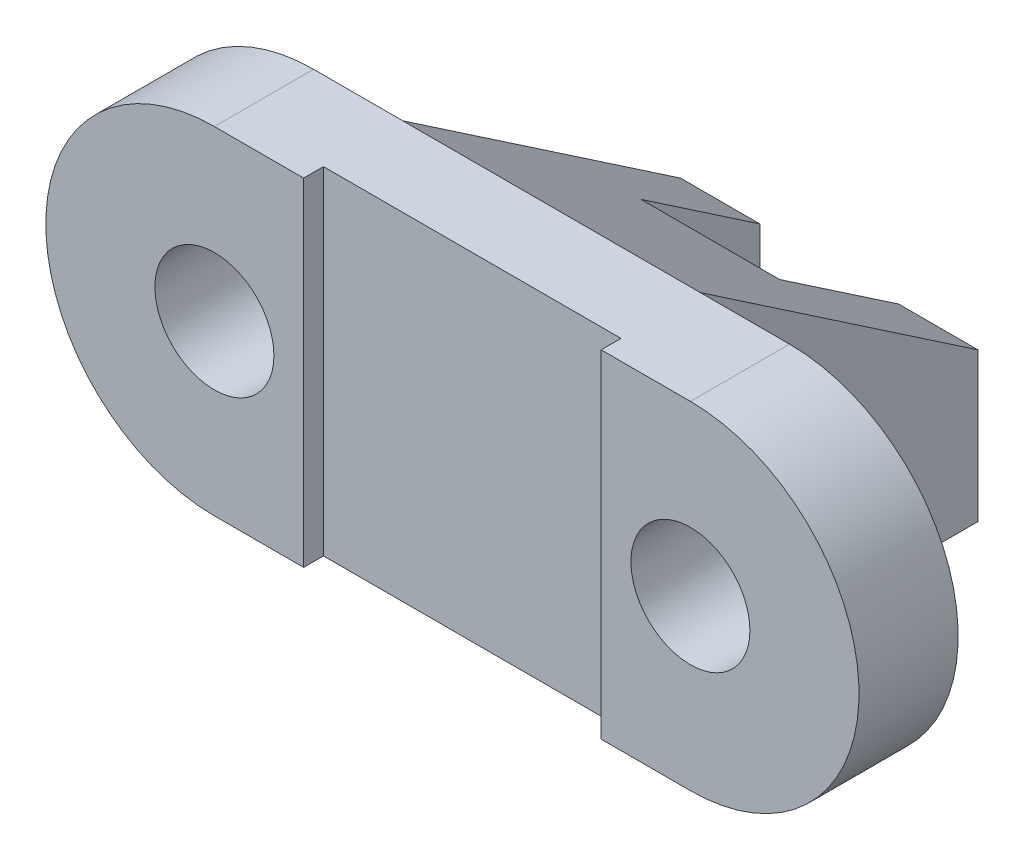
ISO-10303-21;
HEADER;
FILE_DESCRIPTION(('STEP AP214'),'2;1');
FILE_NAME('part.step','',(''),(''),'','','');
FILE_SCHEMA(('AUTOMOTIVE_DESIGN { 1 0 10303 214 1 1 1 1 }'));
ENDSEC;
DATA;
#1=APPLICATION_CONTEXT('core data for automotive mechanical design processes');
#2=APPLICATION_PROTOCOL_DEFINITION('international standard','automotive_design',2000,#1);
#3=PRODUCT_CONTEXT('',#1,'mechanical');
#4=PRODUCT('Part','Part','',(#3));
#5=PRODUCT_RELATED_PRODUCT_CATEGORY('part','',(#4));
#6=PRODUCT_DEFINITION_FORMATION('','',#4);
#7=PRODUCT_DEFINITION_CONTEXT('part definition',#1,'design');
#8=PRODUCT_DEFINITION('design','',#6,#7);
#9=PRODUCT_DEFINITION_SHAPE('','',#8);
#10=(LENGTH_UNIT() NAMED_UNIT(*) SI_UNIT(.MILLI.,.METRE.));
#11=(NAMED_UNIT(*) PLANE_ANGLE_UNIT() SI_UNIT($,.RADIAN.));
#12=(NAMED_UNIT(*) SI_UNIT($,.STERADIAN.) SOLID_ANGLE_UNIT());
#13=UNCERTAINTY_MEASURE_WITH_UNIT(LENGTH_MEASURE(1.E-05),#10,'distance_accuracy_value','');
#14=(GEOMETRIC_REPRESENTATION_CONTEXT(3) GLOBAL_UNCERTAINTY_ASSIGNED_CONTEXT((#13)) GLOBAL_UNIT_ASSIGNED_CONTEXT((#10,
#11,#12)) REPRESENTATION_CONTEXT('',''));
#15=CARTESIAN_POINT('',(0.,0.,0.));
#16=DIRECTION('',(0.,0.,1.));
#17=DIRECTION('',(1.,0.,0.));
#18=AXIS2_PLACEMENT_3D('',#15,#16,#17);
#19=CARTESIAN_POINT('',(-24.,0.,10.));
#20=DIRECTION('',(0.,0.,1.));
#21=DIRECTION('',(1.,0.,0.));
#22=AXIS2_PLACEMENT_3D('',#19,#20,#21);
#23=PLANE('',#22);
#24=DIRECTION('',(0.,1.,0.));
#25=VECTOR('',#24,1.);
#26=CARTESIAN_POINT('',(15.,0.,10.));
#27=LINE('',#26,#25);
#28=CARTESIAN_POINT('',(15.,-17.,10.));
#29=VERTEX_POINT('',#28);
#30=CARTESIAN_POINT('',(15.,17.,10.));
#31=VERTEX_POINT('',#30);
#32=EDGE_CURVE('E11',#29,#31,#27,.T.);
#33=ORIENTED_EDGE('',*,*,#32,.F.);
#34=DIRECTION('',(1.,0.,0.));
#35=VECTOR('',#34,1.);
#36=CARTESIAN_POINT('',(24.,-17.,10.));
#37=LINE('',#36,#35);
#38=CARTESIAN_POINT('',(24.,-17.,10.));
#39=VERTEX_POINT('',#38);
#40=EDGE_CURVE('E244',#29,#39,#37,.T.);
#41=ORIENTED_EDGE('',*,*,#40,.T.);
#42=CARTESIAN_POINT('',(24.,0.,10.));
#43=DIRECTION('',(0.,0.,1.));
#44=DIRECTION('',(-1.,0.,0.));
#45=AXIS2_PLACEMENT_3D('',#42,#43,#44);
#46=CIRCLE('',#45,17.);
#47=CARTESIAN_POINT('',(24.,17.,10.));
#48=VERTEX_POINT('',#47);
#49=EDGE_CURVE('E249',#39,#48,#46,.T.);
#50=ORIENTED_EDGE('',*,*,#49,.T.);
#51=DIRECTION('',(-1.,0.,0.));
#52=VECTOR('',#51,1.);
#53=CARTESIAN_POINT('',(24.,17.,10.));
#54=LINE('',#53,#52);
#55=EDGE_CURVE('E252',#48,#31,#54,.T.);
#56=ORIENTED_EDGE('',*,*,#55,.T.);
#57=EDGE_LOOP('',(#33,#41,#50,#56));
#58=FACE_BOUND('',#57,.T.);
#59=CARTESIAN_POINT('',(24.0000000000001,0.,10.));
#60=DIRECTION('',(0.,0.,1.));
#61=DIRECTION('',(1.,0.,0.));
#62=AXIS2_PLACEMENT_3D('',#59,#60,#61);
#63=CIRCLE('',#62,6.);
#64=CARTESIAN_POINT('',(30.0000000000001,0.,10.));
#65=VERTEX_POINT('',#64);
#66=EDGE_CURVE('E232',#65,#65,#63,.F.);
#67=ORIENTED_EDGE('',*,*,#66,.T.);
#68=EDGE_LOOP('',(#67));
#69=FACE_BOUND('',#68,.T.);
#70=ADVANCED_FACE('F41',(#58,#69),#23,.T.);
#71=CARTESIAN_POINT('',(24.,-17.,10.));
#72=DIRECTION('',(0.,1.,0.));
#73=DIRECTION('',(-1.,0.,0.));
#74=AXIS2_PLACEMENT_3D('',#71,#72,#73);
#75=PLANE('',#74);
#76=ORIENTED_EDGE('',*,*,#40,.F.);
#77=DIRECTION('',(0.,0.,1.));
#78=VECTOR('',#77,1.);
#79=CARTESIAN_POINT('',(15.,-17.,8.00000000000001));
#80=LINE('',#79,#78);
#81=CARTESIAN_POINT('',(15.,-17.,8.00000000000001));
#82=VERTEX_POINT('',#81);
#83=EDGE_CURVE('E183',#82,#29,#80,.T.);
#84=ORIENTED_EDGE('',*,*,#83,.F.);
#85=DIRECTION('',(1.,0.,0.));
#86=VECTOR('',#85,1.);
#87=CARTESIAN_POINT('',(-15.,-17.,8.00000000000001));
#88=LINE('',#87,#86);
#89=CARTESIAN_POINT('',(-15.,-17.,8.00000000000001));
#90=VERTEX_POINT('',#89);
#91=EDGE_CURVE('E170',#90,#82,#88,.T.);
#92=ORIENTED_EDGE('',*,*,#91,.F.);
#93=DIRECTION('',(0.,0.,-1.));
#94=VECTOR('',#93,1.);
#95=CARTESIAN_POINT('',(-15.,-17.,8.00000000000001));
#96=LINE('',#95,#94);
#97=CARTESIAN_POINT('',(-15.,-17.,10.));
#98=VERTEX_POINT('',#97);
#99=EDGE_CURVE('E179',#98,#90,#96,.T.);
#100=ORIENTED_EDGE('',*,*,#99,.F.);
#101=CARTESIAN_POINT('',(-24.,-17.,10.));
#102=VERTEX_POINT('',#101);
#103=EDGE_CURVE('E246',#102,#98,#37,.T.);
#104=ORIENTED_EDGE('',*,*,#103,.F.);
#105=DIRECTION('',(0.,0.,-1.));
#106=VECTOR('',#105,1.);
#107=CARTESIAN_POINT('',(-24.,-17.,10.));
#108=LINE('',#107,#106);
#109=CARTESIAN_POINT('',(-24.,-17.,0.));
#110=VERTEX_POINT('',#109);
#111=EDGE_CURVE('E274',#102,#110,#108,.T.);
#112=ORIENTED_EDGE('',*,*,#111,.T.);
#113=DIRECTION('',(1.,0.,0.));
#114=VECTOR('',#113,1.);
#115=CARTESIAN_POINT('',(24.,-17.,0.));
#116=LINE('',#115,#114);
#117=CARTESIAN_POINT('',(-15.,-17.,0.));
#118=VERTEX_POINT('',#117);
#119=EDGE_CURVE('E258',#110,#118,#116,.T.);
#120=ORIENTED_EDGE('',*,*,#119,.T.);
#121=DIRECTION('',(0.,0.,1.));
#122=VECTOR('',#121,1.);
#123=CARTESIAN_POINT('',(-15.,-17.,-28.));
#124=LINE('',#123,#122);
#125=CARTESIAN_POINT('',(-15.,-17.,-28.));
#126=VERTEX_POINT('',#125);
#127=EDGE_CURVE('E220',#126,#118,#124,.T.);
#128=ORIENTED_EDGE('',*,*,#127,.F.);
#129=DIRECTION('',(1.,0.,0.));
#130=VECTOR('',#129,1.);
#131=CARTESIAN_POINT('',(-15.,-17.,-28.));
#132=LINE('',#131,#130);
#133=CARTESIAN_POINT('',(-7.,-17.,-28.));
#134=VERTEX_POINT('',#133);
#135=EDGE_CURVE('E217',#126,#134,#132,.T.);
#136=ORIENTED_EDGE('',*,*,#135,.T.);
#137=DIRECTION('',(0.,0.,-1.));
#138=VECTOR('',#137,1.);
#139=CARTESIAN_POINT('',(-7.,-17.,10.));
#140=LINE('',#139,#138);
#141=CARTESIAN_POINT('',(-7.,-17.,-16.));
#142=VERTEX_POINT('',#141);
#143=EDGE_CURVE('E204',#142,#134,#140,.T.);
#144=ORIENTED_EDGE('',*,*,#143,.F.);
#145=DIRECTION('',(-1.,0.,0.));
#146=VECTOR('',#145,1.);
#147=CARTESIAN_POINT('',(24.,-17.,-16.));
#148=LINE('',#147,#146);
#149=CARTESIAN_POINT('',(7.,-17.,-16.));
#150=VERTEX_POINT('',#149);
#151=EDGE_CURVE('E207',#150,#142,#148,.T.);
#152=ORIENTED_EDGE('',*,*,#151,.F.);
#153=DIRECTION('',(0.,0.,1.));
#154=VECTOR('',#153,1.);
#155=CARTESIAN_POINT('',(7.,-17.,10.));
#156=LINE('',#155,#154);
#157=CARTESIAN_POINT('',(7.,-17.,-28.));
#158=VERTEX_POINT('',#157);
#159=EDGE_CURVE('E202',#158,#150,#156,.T.);
#160=ORIENTED_EDGE('',*,*,#159,.F.);
#161=CARTESIAN_POINT('',(15.,-17.,-28.));
#162=VERTEX_POINT('',#161);
#163=EDGE_CURVE('E216',#158,#162,#132,.T.);
#164=ORIENTED_EDGE('',*,*,#163,.T.);
#165=DIRECTION('',(0.,0.,1.));
#166=VECTOR('',#165,1.);
#167=CARTESIAN_POINT('',(15.,-17.,-28.));
#168=LINE('',#167,#166);
#169=CARTESIAN_POINT('',(15.,-17.,0.));
#170=VERTEX_POINT('',#169);
#171=EDGE_CURVE('E225',#162,#170,#168,.T.);
#172=ORIENTED_EDGE('',*,*,#171,.T.);
#173=CARTESIAN_POINT('',(24.,-17.,0.));
#174=VERTEX_POINT('',#173);
#175=EDGE_CURVE('E257',#170,#174,#116,.T.);
#176=ORIENTED_EDGE('',*,*,#175,.T.);
#177=DIRECTION('',(0.,0.,-1.));
#178=VECTOR('',#177,1.);
#179=CARTESIAN_POINT('',(24.,-17.,10.));
#180=LINE('',#179,#178);
#181=EDGE_CURVE('E271',#39,#174,#180,.T.);
#182=ORIENTED_EDGE('',*,*,#181,.F.);
#183=EDGE_LOOP('',(#76,#84,#92,#100,#104,#112,#120,#128,#136,#144,#152,#160,#164,#172,#176,#182));
#184=FACE_BOUND('',#183,.T.);
#185=ADVANCED_FACE('F288',(#184),#75,.F.);
#186=CARTESIAN_POINT('',(24.,17.,10.));
#187=DIRECTION('',(0.,-1.,0.));
#188=DIRECTION('',(1.,0.,0.));
#189=AXIS2_PLACEMENT_3D('',#186,#187,#188);
#190=PLANE('',#189);
#191=DIRECTION('',(-1.,0.,0.));
#192=VECTOR('',#191,1.);
#193=CARTESIAN_POINT('',(-15.,17.,8.00000000000001));
#194=LINE('',#193,#192);
#195=CARTESIAN_POINT('',(15.,17.,8.00000000000001));
#196=VERTEX_POINT('',#195);
#197=CARTESIAN_POINT('',(-15.,17.,8.00000000000001));
#198=VERTEX_POINT('',#197);
#199=EDGE_CURVE('E163',#196,#198,#194,.T.);
#200=ORIENTED_EDGE('',*,*,#199,.F.);
#201=DIRECTION('',(0.,0.,-1.));
#202=VECTOR('',#201,1.);
#203=CARTESIAN_POINT('',(15.,17.,8.00000000000001));
#204=LINE('',#203,#202);
#205=EDGE_CURVE('E153',#31,#196,#204,.T.);
#206=ORIENTED_EDGE('',*,*,#205,.F.);
#207=ORIENTED_EDGE('',*,*,#55,.F.);
#208=DIRECTION('',(0.,0.,-1.));
#209=VECTOR('',#208,1.);
#210=CARTESIAN_POINT('',(24.,17.,10.));
#211=LINE('',#210,#209);
#212=CARTESIAN_POINT('',(24.,17.,0.));
#213=VERTEX_POINT('',#212);
#214=EDGE_CURVE('E268',#48,#213,#211,.T.);
#215=ORIENTED_EDGE('',*,*,#214,.T.);
#216=DIRECTION('',(-1.,0.,0.));
#217=VECTOR('',#216,1.);
#218=CARTESIAN_POINT('',(24.,17.,0.));
#219=LINE('',#218,#217);
#220=CARTESIAN_POINT('',(15.,17.,0.));
#221=VERTEX_POINT('',#220);
#222=EDGE_CURVE('E245',#213,#221,#219,.T.);
#223=ORIENTED_EDGE('',*,*,#222,.T.);
#224=DIRECTION('',(-1.,0.,0.));
#225=VECTOR('',#224,1.);
#226=CARTESIAN_POINT('',(30.,17.,0.));
#227=LINE('',#226,#225);
#228=CARTESIAN_POINT('',(-15.,17.,0.));
#229=VERTEX_POINT('',#228);
#230=EDGE_CURVE('E185',#221,#229,#227,.T.);
#231=ORIENTED_EDGE('',*,*,#230,.T.);
#232=CARTESIAN_POINT('',(-24.,17.,0.));
#233=VERTEX_POINT('',#232);
#234=EDGE_CURVE('E263',#229,#233,#219,.T.);
#235=ORIENTED_EDGE('',*,*,#234,.T.);
#236=DIRECTION('',(0.,0.,-1.));
#237=VECTOR('',#236,1.);
#238=CARTESIAN_POINT('',(-24.,17.,10.));
#239=LINE('',#238,#237);
#240=CARTESIAN_POINT('',(-24.,17.,10.));
#241=VERTEX_POINT('',#240);
#242=EDGE_CURVE('E254',#241,#233,#239,.T.);
#243=ORIENTED_EDGE('',*,*,#242,.F.);
#244=CARTESIAN_POINT('',(-15.,17.,10.));
#245=VERTEX_POINT('',#244);
#246=EDGE_CURVE('E251',#245,#241,#54,.T.);
#247=ORIENTED_EDGE('',*,*,#246,.F.);
#248=DIRECTION('',(0.,0.,1.));
#249=VECTOR('',#248,1.);
#250=CARTESIAN_POINT('',(-15.,17.,8.00000000000001));
#251=LINE('',#250,#249);
#252=EDGE_CURVE('E56',#198,#245,#251,.T.);
#253=ORIENTED_EDGE('',*,*,#252,.F.);
#254=EDGE_LOOP('',(#200,#206,#207,#215,#223,#231,#235,#243,#247,#253));
#255=FACE_BOUND('',#254,.T.);
#256=ADVANCED_FACE('F173',(#255),#190,.F.);
#257=CARTESIAN_POINT('',(0.,0.,-28.));
#258=DIRECTION('',(0.,0.,-1.));
#259=DIRECTION('',(-1.,0.,0.));
#260=AXIS2_PLACEMENT_3D('',#257,#258,#259);
#261=PLANE('',#260);
#262=DIRECTION('',(-1.,0.,0.));
#263=VECTOR('',#262,1.);
#264=CARTESIAN_POINT('',(30.,-2.,-28.));
#265=LINE('',#264,#263);
#266=CARTESIAN_POINT('',(-7.00000000000001,-2.,-28.));
#267=VERTEX_POINT('',#266);
#268=CARTESIAN_POINT('',(-15.,-2.,-28.));
#269=VERTEX_POINT('',#268);
#270=EDGE_CURVE('E186',#267,#269,#265,.T.);
#271=ORIENTED_EDGE('',*,*,#270,.F.);
#272=DIRECTION('',(0.,-1.,0.));
#273=VECTOR('',#272,1.);
#274=CARTESIAN_POINT('',(-7.,0.,-28.));
#275=LINE('',#274,#273);
#276=EDGE_CURVE('E280',#267,#134,#275,.T.);
#277=ORIENTED_EDGE('',*,*,#276,.T.);
#278=ORIENTED_EDGE('',*,*,#135,.F.);
#279=DIRECTION('',(0.,-1.,0.));
#280=VECTOR('',#279,1.);
#281=CARTESIAN_POINT('',(-15.,-17.,-28.));
#282=LINE('',#281,#280);
#283=EDGE_CURVE('E213',#269,#126,#282,.T.);
#284=ORIENTED_EDGE('',*,*,#283,.F.);
#285=EDGE_LOOP('',(#271,#277,#278,#284));
#286=FACE_BOUND('',#285,.T.);
#287=ADVANCED_FACE('F309',(#286),#261,.T.);
#288=CARTESIAN_POINT('',(15.,-2.,-28.));
#289=VERTEX_POINT('',#288);
#290=CARTESIAN_POINT('',(7.,-2.,-28.));
#291=VERTEX_POINT('',#290);
#292=EDGE_CURVE('E64',#289,#291,#265,.T.);
#293=ORIENTED_EDGE('',*,*,#292,.F.);
#294=DIRECTION('',(0.,1.,0.));
#295=VECTOR('',#294,1.);
#296=CARTESIAN_POINT('',(15.,-17.,-28.));
#297=LINE('',#296,#295);
#298=EDGE_CURVE('E210',#162,#289,#297,.T.);
#299=ORIENTED_EDGE('',*,*,#298,.F.);
#300=ORIENTED_EDGE('',*,*,#163,.F.);
#301=DIRECTION('',(0.,1.,0.));
#302=VECTOR('',#301,1.);
#303=CARTESIAN_POINT('',(7.,0.,-28.));
#304=LINE('',#303,#302);
#305=EDGE_CURVE('E277',#158,#291,#304,.T.);
#306=ORIENTED_EDGE('',*,*,#305,.T.);
#307=EDGE_LOOP('',(#293,#299,#300,#306));
#308=FACE_BOUND('',#307,.T.);
#309=ADVANCED_FACE('F328',(#308),#261,.T.);
#310=CARTESIAN_POINT('',(-24.,0.,0.));
#311=DIRECTION('',(0.,0.,1.));
#312=DIRECTION('',(1.,0.,0.));
#313=AXIS2_PLACEMENT_3D('',#310,#311,#312);
#314=PLANE('',#313);
#315=CARTESIAN_POINT('',(24.0000000000001,0.,0.));
#316=DIRECTION('',(0.,0.,1.));
#317=DIRECTION('',(1.,0.,0.));
#318=AXIS2_PLACEMENT_3D('',#315,#316,#317);
#319=CIRCLE('',#318,6.);
#320=CARTESIAN_POINT('',(30.0000000000001,0.,0.));
#321=VERTEX_POINT('',#320);
#322=EDGE_CURVE('E227',#321,#321,#319,.T.);
#323=ORIENTED_EDGE('',*,*,#322,.T.);
#324=EDGE_LOOP('',(#323));
#325=FACE_BOUND('',#324,.T.);
#326=ORIENTED_EDGE('',*,*,#175,.F.);
#327=DIRECTION('',(0.,1.,0.));
#328=VECTOR('',#327,1.);
#329=CARTESIAN_POINT('',(15.,-17.,0.));
#330=LINE('',#329,#328);
#331=EDGE_CURVE('E209',#170,#221,#330,.T.);
#332=ORIENTED_EDGE('',*,*,#331,.T.);
#333=ORIENTED_EDGE('',*,*,#222,.F.);
#334=CARTESIAN_POINT('',(24.,0.,0.));
#335=DIRECTION('',(0.,0.,1.));
#336=DIRECTION('',(-1.,0.,0.));
#337=AXIS2_PLACEMENT_3D('',#334,#335,#336);
#338=CIRCLE('',#337,17.);
#339=EDGE_CURVE('E261',#174,#213,#338,.T.);
#340=ORIENTED_EDGE('',*,*,#339,.F.);
#341=EDGE_LOOP('',(#326,#332,#333,#340));
#342=FACE_BOUND('',#341,.T.);
#343=ADVANCED_FACE('F342',(#325,#342),#314,.F.);
#344=CARTESIAN_POINT('',(-24.,0.,10.));
#345=DIRECTION('',(0.,0.,-1.));
#346=DIRECTION('',(-1.,0.,0.));
#347=AXIS2_PLACEMENT_3D('',#344,#345,#346);
#348=CYLINDRICAL_SURFACE('',#347,17.);
#349=CARTESIAN_POINT('',(-24.,0.,0.));
#350=DIRECTION('',(0.,0.,1.));
#351=DIRECTION('',(1.,0.,0.));
#352=AXIS2_PLACEMENT_3D('',#349,#350,#351);
#353=CIRCLE('',#352,17.);
#354=EDGE_CURVE('E240',#233,#110,#353,.T.);
#355=ORIENTED_EDGE('',*,*,#354,.T.);
#356=ORIENTED_EDGE('',*,*,#111,.F.);
#357=CARTESIAN_POINT('',(-24.,0.,10.));
#358=DIRECTION('',(0.,0.,1.));
#359=DIRECTION('',(1.,0.,0.));
#360=AXIS2_PLACEMENT_3D('',#357,#358,#359);
#361=CIRCLE('',#360,17.);
#362=EDGE_CURVE('E241',#241,#102,#361,.T.);
#363=ORIENTED_EDGE('',*,*,#362,.F.);
#364=ORIENTED_EDGE('',*,*,#242,.T.);
#365=EDGE_LOOP('',(#355,#356,#363,#364));
#366=FACE_BOUND('',#365,.T.);
#367=ADVANCED_FACE('F43',(#366),#348,.T.);
#368=CARTESIAN_POINT('',(24.,0.,10.));
#369=DIRECTION('',(0.,0.,-1.));
#370=DIRECTION('',(-1.,0.,0.));
#371=AXIS2_PLACEMENT_3D('',#368,#369,#370);
#372=CYLINDRICAL_SURFACE('',#371,17.);
#373=ORIENTED_EDGE('',*,*,#339,.T.);
#374=ORIENTED_EDGE('',*,*,#214,.F.);
#375=ORIENTED_EDGE('',*,*,#49,.F.);
#376=ORIENTED_EDGE('',*,*,#181,.T.);
#377=EDGE_LOOP('',(#373,#374,#375,#376));
#378=FACE_BOUND('',#377,.T.);
#379=ADVANCED_FACE('F339',(#378),#372,.T.);
#380=DIRECTION('',(0.,-1.,0.));
#381=VECTOR('',#380,1.);
#382=CARTESIAN_POINT('',(-15.,0.,10.));
#383=LINE('',#382,#381);
#384=EDGE_CURVE('E49',#245,#98,#383,.T.);
#385=ORIENTED_EDGE('',*,*,#384,.F.);
#386=ORIENTED_EDGE('',*,*,#246,.T.);
#387=ORIENTED_EDGE('',*,*,#362,.T.);
#388=ORIENTED_EDGE('',*,*,#103,.T.);
#389=EDGE_LOOP('',(#385,#386,#387,#388));
#390=FACE_BOUND('',#389,.T.);
#391=CARTESIAN_POINT('',(-23.9999999999999,0.,10.));
#392=DIRECTION('',(0.,0.,1.));
#393=DIRECTION('',(1.,0.,0.));
#394=AXIS2_PLACEMENT_3D('',#391,#392,#393);
#395=CIRCLE('',#394,6.);
#396=CARTESIAN_POINT('',(-17.9999999999999,0.,10.));
#397=VERTEX_POINT('',#396);
#398=EDGE_CURVE('E237',#397,#397,#395,.F.);
#399=ORIENTED_EDGE('',*,*,#398,.T.);
#400=EDGE_LOOP('',(#399));
#401=FACE_BOUND('',#400,.T.);
#402=ADVANCED_FACE('F290',(#390,#401),#23,.T.);
#403=CARTESIAN_POINT('',(-23.9999999999999,0.,0.));
#404=DIRECTION('',(0.,0.,1.));
#405=DIRECTION('',(1.,0.,0.));
#406=AXIS2_PLACEMENT_3D('',#403,#404,#405);
#407=CIRCLE('',#406,6.);
#408=CARTESIAN_POINT('',(-17.9999999999999,0.,0.));
#409=VERTEX_POINT('',#408);
#410=EDGE_CURVE('E229',#409,#409,#407,.T.);
#411=ORIENTED_EDGE('',*,*,#410,.T.);
#412=EDGE_LOOP('',(#411));
#413=FACE_BOUND('',#412,.T.);
#414=ORIENTED_EDGE('',*,*,#234,.F.);
#415=DIRECTION('',(0.,-1.,0.));
#416=VECTOR('',#415,1.);
#417=CARTESIAN_POINT('',(-15.,-17.,0.));
#418=LINE('',#417,#416);
#419=EDGE_CURVE('E214',#229,#118,#418,.T.);
#420=ORIENTED_EDGE('',*,*,#419,.T.);
#421=ORIENTED_EDGE('',*,*,#119,.F.);
#422=ORIENTED_EDGE('',*,*,#354,.F.);
#423=EDGE_LOOP('',(#414,#420,#421,#422));
#424=FACE_BOUND('',#423,.T.);
#425=ADVANCED_FACE('F301',(#413,#424),#314,.F.);
#426=CARTESIAN_POINT('',(24.0000000000001,0.,18.));
#427=DIRECTION('',(0.,0.,-1.));
#428=DIRECTION('',(-1.,0.,0.));
#429=AXIS2_PLACEMENT_3D('',#426,#427,#428);
#430=CYLINDRICAL_SURFACE('',#429,6.);
#431=ORIENTED_EDGE('',*,*,#66,.F.);
#432=EDGE_LOOP('',(#431));
#433=FACE_BOUND('',#432,.T.);
#434=ORIENTED_EDGE('',*,*,#322,.F.);
#435=EDGE_LOOP('',(#434));
#436=FACE_BOUND('',#435,.T.);
#437=ADVANCED_FACE('F349',(#433,#436),#430,.F.);
#438=CARTESIAN_POINT('',(-23.9999999999999,0.,18.));
#439=DIRECTION('',(0.,0.,-1.));
#440=DIRECTION('',(-1.,0.,0.));
#441=AXIS2_PLACEMENT_3D('',#438,#439,#440);
#442=CYLINDRICAL_SURFACE('',#441,6.);
#443=ORIENTED_EDGE('',*,*,#398,.F.);
#444=EDGE_LOOP('',(#443));
#445=FACE_BOUND('',#444,.T.);
#446=ORIENTED_EDGE('',*,*,#410,.F.);
#447=EDGE_LOOP('',(#446));
#448=FACE_BOUND('',#447,.T.);
#449=ADVANCED_FACE('F352',(#445,#448),#442,.F.);
#450=CARTESIAN_POINT('',(15.,-17.,-28.));
#451=DIRECTION('',(1.,0.,0.));
#452=DIRECTION('',(0.,0.,-1.));
#453=AXIS2_PLACEMENT_3D('',#450,#451,#452);
#454=PLANE('',#453);
#455=DIRECTION('',(0.,-0.561501418337265,-0.827475774391759));
#456=VECTOR('',#455,1.);
#457=CARTESIAN_POINT('',(15.,-6.72925764192139,-34.9694323144105));
#458=LINE('',#457,#456);
#459=EDGE_CURVE('E194',#221,#289,#458,.T.);
#460=ORIENTED_EDGE('',*,*,#459,.F.);
#461=ORIENTED_EDGE('',*,*,#331,.F.);
#462=ORIENTED_EDGE('',*,*,#171,.F.);
#463=ORIENTED_EDGE('',*,*,#298,.T.);
#464=EDGE_LOOP('',(#460,#461,#462,#463));
#465=FACE_BOUND('',#464,.T.);
#466=ADVANCED_FACE('F331',(#465),#454,.T.);
#467=CARTESIAN_POINT('',(-15.,-17.,-28.));
#468=DIRECTION('',(-1.,0.,0.));
#469=DIRECTION('',(0.,0.,1.));
#470=AXIS2_PLACEMENT_3D('',#467,#468,#469);
#471=PLANE('',#470);
#472=DIRECTION('',(0.,0.561501418337264,0.827475774391758));
#473=VECTOR('',#472,1.);
#474=CARTESIAN_POINT('',(-15.,-2.,-28.));
#475=LINE('',#474,#473);
#476=EDGE_CURVE('E182',#269,#229,#475,.T.);
#477=ORIENTED_EDGE('',*,*,#476,.F.);
#478=ORIENTED_EDGE('',*,*,#283,.T.);
#479=ORIENTED_EDGE('',*,*,#127,.T.);
#480=ORIENTED_EDGE('',*,*,#419,.F.);
#481=EDGE_LOOP('',(#477,#478,#479,#480));
#482=FACE_BOUND('',#481,.T.);
#483=ADVANCED_FACE('F305',(#482),#471,.T.);
#484=CARTESIAN_POINT('',(7.,-31.,-16.));
#485=DIRECTION('',(0.,0.,-1.));
#486=DIRECTION('',(-1.,0.,0.));
#487=AXIS2_PLACEMENT_3D('',#484,#485,#486);
#488=PLANE('',#487);
#489=DIRECTION('',(-1.,0.,0.));
#490=VECTOR('',#489,1.);
#491=CARTESIAN_POINT('',(7.,6.14285714285714,-16.));
#492=LINE('',#491,#490);
#493=CARTESIAN_POINT('',(7.,6.14285714285714,-16.));
#494=VERTEX_POINT('',#493);
#495=CARTESIAN_POINT('',(-7.,6.14285714285714,-16.));
#496=VERTEX_POINT('',#495);
#497=EDGE_CURVE('E190',#494,#496,#492,.T.);
#498=ORIENTED_EDGE('',*,*,#497,.F.);
#499=DIRECTION('',(0.,1.,0.));
#500=VECTOR('',#499,1.);
#501=CARTESIAN_POINT('',(7.,-31.,-16.));
#502=LINE('',#501,#500);
#503=EDGE_CURVE('E199',#150,#494,#502,.T.);
#504=ORIENTED_EDGE('',*,*,#503,.F.);
#505=ORIENTED_EDGE('',*,*,#151,.T.);
#506=DIRECTION('',(0.,1.,0.));
#507=VECTOR('',#506,1.);
#508=CARTESIAN_POINT('',(-7.,-31.,-16.));
#509=LINE('',#508,#507);
#510=EDGE_CURVE('E196',#142,#496,#509,.T.);
#511=ORIENTED_EDGE('',*,*,#510,.T.);
#512=EDGE_LOOP('',(#498,#504,#505,#511));
#513=FACE_BOUND('',#512,.T.);
#514=ADVANCED_FACE('F320',(#513),#488,.T.);
#515=CARTESIAN_POINT('',(-7.,-31.,-40.));
#516=DIRECTION('',(1.,0.,0.));
#517=DIRECTION('',(0.,1.,0.));
#518=AXIS2_PLACEMENT_3D('',#515,#516,#517);
#519=PLANE('',#518);
#520=DIRECTION('',(0.,-0.561501418337265,-0.827475774391759));
#521=VECTOR('',#520,1.);
#522=CARTESIAN_POINT('',(-7.,-16.7187772925764,-49.6908296943231));
#523=LINE('',#522,#521);
#524=EDGE_CURVE('E192',#496,#267,#523,.T.);
#525=ORIENTED_EDGE('',*,*,#524,.F.);
#526=ORIENTED_EDGE('',*,*,#510,.F.);
#527=ORIENTED_EDGE('',*,*,#143,.T.);
#528=ORIENTED_EDGE('',*,*,#276,.F.);
#529=EDGE_LOOP('',(#525,#526,#527,#528));
#530=FACE_BOUND('',#529,.T.);
#531=ADVANCED_FACE('F317',(#530),#519,.T.);
#532=CARTESIAN_POINT('',(7.,-31.,-40.));
#533=DIRECTION('',(-1.,0.,0.));
#534=DIRECTION('',(0.,-1.,0.));
#535=AXIS2_PLACEMENT_3D('',#532,#533,#534);
#536=PLANE('',#535);
#537=DIRECTION('',(0.,0.561501418337265,0.827475774391759));
#538=VECTOR('',#537,1.);
#539=CARTESIAN_POINT('',(7.,-16.7187772925764,-49.6908296943231));
#540=LINE('',#539,#538);
#541=EDGE_CURVE('E282',#291,#494,#540,.T.);
#542=ORIENTED_EDGE('',*,*,#541,.F.);
#543=ORIENTED_EDGE('',*,*,#305,.F.);
#544=ORIENTED_EDGE('',*,*,#159,.T.);
#545=ORIENTED_EDGE('',*,*,#503,.T.);
#546=EDGE_LOOP('',(#542,#543,#544,#545));
#547=FACE_BOUND('',#546,.T.);
#548=ADVANCED_FACE('F323',(#547),#536,.T.);
#549=CARTESIAN_POINT('',(30.,-2.,-28.));
#550=DIRECTION('',(0.,-0.827475774391758,0.561501418337264));
#551=DIRECTION('',(0.,-0.561501418337265,-0.827475774391759));
#552=AXIS2_PLACEMENT_3D('',#549,#550,#551);
#553=PLANE('',#552);
#554=ORIENTED_EDGE('',*,*,#459,.T.);
#555=ORIENTED_EDGE('',*,*,#292,.T.);
#556=ORIENTED_EDGE('',*,*,#541,.T.);
#557=ORIENTED_EDGE('',*,*,#497,.T.);
#558=ORIENTED_EDGE('',*,*,#524,.T.);
#559=ORIENTED_EDGE('',*,*,#270,.T.);
#560=ORIENTED_EDGE('',*,*,#476,.T.);
#561=ORIENTED_EDGE('',*,*,#230,.F.);
#562=EDGE_LOOP('',(#554,#555,#556,#557,#558,#559,#560,#561));
#563=FACE_BOUND('',#562,.T.);
#564=ADVANCED_FACE('F387',(#563),#553,.F.);
#565=CARTESIAN_POINT('',(15.,-47.2654919008431,8.00000000000001));
#566=DIRECTION('',(1.,0.,0.));
#567=DIRECTION('',(0.,1.,0.));
#568=AXIS2_PLACEMENT_3D('',#565,#566,#567);
#569=PLANE('',#568);
#570=ORIENTED_EDGE('',*,*,#32,.T.);
#571=ORIENTED_EDGE('',*,*,#205,.T.);
#572=DIRECTION('',(0.,1.,0.));
#573=VECTOR('',#572,1.);
#574=CARTESIAN_POINT('',(15.,-47.2654919008431,8.00000000000001));
#575=LINE('',#574,#573);
#576=EDGE_CURVE('E156',#82,#196,#575,.T.);
#577=ORIENTED_EDGE('',*,*,#576,.F.);
#578=ORIENTED_EDGE('',*,*,#83,.T.);
#579=EDGE_LOOP('',(#570,#571,#577,#578));
#580=FACE_BOUND('',#579,.T.);
#581=ADVANCED_FACE('F155',(#580),#569,.F.);
#582=CARTESIAN_POINT('',(-15.,-47.2654919008431,8.00000000000001));
#583=DIRECTION('',(-1.,0.,0.));
#584=DIRECTION('',(0.,-1.,0.));
#585=AXIS2_PLACEMENT_3D('',#582,#583,#584);
#586=PLANE('',#585);
#587=ORIENTED_EDGE('',*,*,#384,.T.);
#588=ORIENTED_EDGE('',*,*,#99,.T.);
#589=DIRECTION('',(0.,1.,0.));
#590=VECTOR('',#589,1.);
#591=CARTESIAN_POINT('',(-15.,-47.2654919008431,8.00000000000001));
#592=LINE('',#591,#590);
#593=EDGE_CURVE('E171',#90,#198,#592,.T.);
#594=ORIENTED_EDGE('',*,*,#593,.T.);
#595=ORIENTED_EDGE('',*,*,#252,.T.);
#596=EDGE_LOOP('',(#587,#588,#594,#595));
#597=FACE_BOUND('',#596,.T.);
#598=ADVANCED_FACE('F284',(#597),#586,.F.);
#599=CARTESIAN_POINT('',(-15.,-47.2654919008431,8.00000000000001));
#600=DIRECTION('',(0.,0.,-1.));
#601=DIRECTION('',(-1.,0.,0.));
#602=AXIS2_PLACEMENT_3D('',#599,#600,#601);
#603=PLANE('',#602);
#604=ORIENTED_EDGE('',*,*,#91,.T.);
#605=ORIENTED_EDGE('',*,*,#576,.T.);
#606=ORIENTED_EDGE('',*,*,#199,.T.);
#607=ORIENTED_EDGE('',*,*,#593,.F.);
#608=EDGE_LOOP('',(#604,#605,#606,#607));
#609=FACE_BOUND('',#608,.T.);
#610=ADVANCED_FACE('F167',(#609),#603,.F.);
#611=CLOSED_SHELL('',(#70,#185,#256,#287,#309,#343,#367,#379,#402,#425,#437,#449,#466,#483,#514,
#531,#548,#564,#581,#598,#610));
#612=MANIFOLD_SOLID_BREP('B2',#611);
#613=ADVANCED_BREP_SHAPE_REPRESENTATION('',(#18,#612),#14);
#614=SHAPE_DEFINITION_REPRESENTATION(#9,#613);
ENDSEC;
END-ISO-10303-21;
